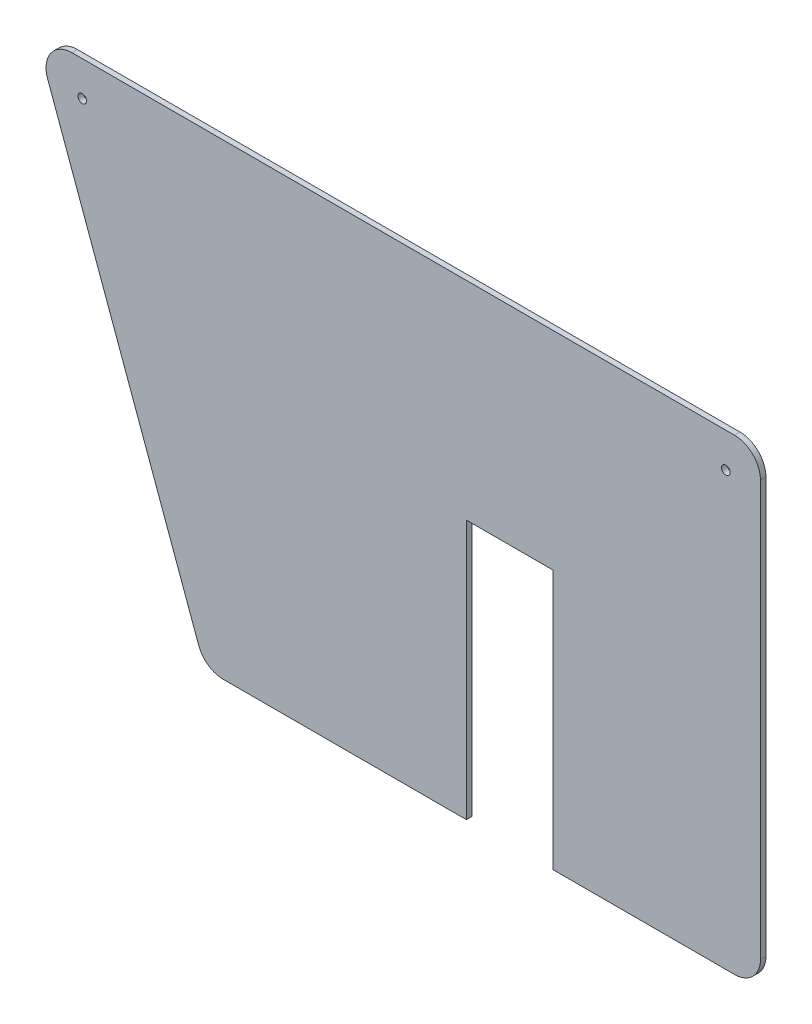
ISO-10303-21;
HEADER;
FILE_DESCRIPTION(('STEP AP214'),'2;1');
FILE_NAME('part.step','',(''),(''),'','','');
FILE_SCHEMA(('AUTOMOTIVE_DESIGN { 1 0 10303 214 1 1 1 1 }'));
ENDSEC;
DATA;
#1=APPLICATION_CONTEXT('core data for automotive mechanical design processes');
#2=APPLICATION_PROTOCOL_DEFINITION('international standard','automotive_design',2000,#1);
#3=PRODUCT_CONTEXT('',#1,'mechanical');
#4=PRODUCT('Part','Part','',(#3));
#5=PRODUCT_RELATED_PRODUCT_CATEGORY('part','',(#4));
#6=PRODUCT_DEFINITION_FORMATION('','',#4);
#7=PRODUCT_DEFINITION_CONTEXT('part definition',#1,'design');
#8=PRODUCT_DEFINITION('design','',#6,#7);
#9=PRODUCT_DEFINITION_SHAPE('','',#8);
#10=(LENGTH_UNIT() NAMED_UNIT(*) SI_UNIT(.MILLI.,.METRE.));
#11=(NAMED_UNIT(*) PLANE_ANGLE_UNIT() SI_UNIT($,.RADIAN.));
#12=(NAMED_UNIT(*) SI_UNIT($,.STERADIAN.) SOLID_ANGLE_UNIT());
#13=UNCERTAINTY_MEASURE_WITH_UNIT(LENGTH_MEASURE(1.E-05),#10,'distance_accuracy_value','');
#14=(GEOMETRIC_REPRESENTATION_CONTEXT(3) GLOBAL_UNCERTAINTY_ASSIGNED_CONTEXT((#13)) GLOBAL_UNIT_ASSIGNED_CONTEXT((#10,
#11,#12)) REPRESENTATION_CONTEXT('',''));
#15=CARTESIAN_POINT('',(0.,0.,0.));
#16=DIRECTION('',(0.,0.,1.));
#17=DIRECTION('',(1.,0.,0.));
#18=AXIS2_PLACEMENT_3D('',#15,#16,#17);
#19=CARTESIAN_POINT('',(-321.154386438124,0.,-3.175));
#20=DIRECTION('',(0.,-1.,0.));
#21=DIRECTION('',(1.,0.,0.));
#22=AXIS2_PLACEMENT_3D('',#19,#20,#21);
#23=PLANE('',#22);
#24=DIRECTION('',(0.,0.,-1.));
#25=VECTOR('',#24,1.);
#26=CARTESIAN_POINT('',(-120.,0.,6.825));
#27=LINE('',#26,#25);
#28=CARTESIAN_POINT('',(-120.,0.,0.));
#29=VERTEX_POINT('',#28);
#30=CARTESIAN_POINT('',(-120.,0.,-3.175));
#31=VERTEX_POINT('',#30);
#32=EDGE_CURVE('E165',#29,#31,#27,.T.);
#33=ORIENTED_EDGE('',*,*,#32,.T.);
#34=DIRECTION('',(1.,0.,0.));
#35=VECTOR('',#34,1.);
#36=CARTESIAN_POINT('',(-321.154386438124,0.,-3.175));
#37=LINE('',#36,#35);
#38=CARTESIAN_POINT('',(-15.,0.,-3.175));
#39=VERTEX_POINT('',#38);
#40=EDGE_CURVE('E153',#31,#39,#37,.T.);
#41=ORIENTED_EDGE('',*,*,#40,.T.);
#42=DIRECTION('',(0.,0.,1.));
#43=VECTOR('',#42,1.);
#44=CARTESIAN_POINT('',(-15.,0.,-3.175));
#45=LINE('',#44,#43);
#46=CARTESIAN_POINT('',(-15.,0.,0.));
#47=VERTEX_POINT('',#46);
#48=EDGE_CURVE('E176',#39,#47,#45,.T.);
#49=ORIENTED_EDGE('',*,*,#48,.T.);
#50=DIRECTION('',(1.,0.,0.));
#51=VECTOR('',#50,1.);
#52=CARTESIAN_POINT('',(-321.154386438124,0.,0.));
#53=LINE('',#52,#51);
#54=EDGE_CURVE('E168',#29,#47,#53,.T.);
#55=ORIENTED_EDGE('',*,*,#54,.F.);
#56=EDGE_LOOP('',(#33,#41,#49,#55));
#57=FACE_BOUND('',#56,.T.);
#58=ADVANCED_FACE('F39',(#57),#23,.T.);
#59=CARTESIAN_POINT('',(0.,270.,-3.175));
#60=DIRECTION('',(0.,1.,0.));
#61=DIRECTION('',(-1.,0.,0.));
#62=AXIS2_PLACEMENT_3D('',#59,#60,#61);
#63=PLANE('',#62);
#64=DIRECTION('',(-1.,0.,0.));
#65=VECTOR('',#64,1.);
#66=CARTESIAN_POINT('',(0.,270.,0.));
#67=LINE('',#66,#65);
#68=CARTESIAN_POINT('',(-15.,270.,0.));
#69=VERTEX_POINT('',#68);
#70=CARTESIAN_POINT('',(-398.004129588868,270.,0.));
#71=VERTEX_POINT('',#70);
#72=EDGE_CURVE('E161',#69,#71,#67,.T.);
#73=ORIENTED_EDGE('',*,*,#72,.F.);
#74=DIRECTION('',(0.,0.,1.));
#75=VECTOR('',#74,1.);
#76=CARTESIAN_POINT('',(-15.,270.,-3.175));
#77=LINE('',#76,#75);
#78=CARTESIAN_POINT('',(-15.,270.,-3.175));
#79=VERTEX_POINT('',#78);
#80=EDGE_CURVE('E203',#69,#79,#77,.F.);
#81=ORIENTED_EDGE('',*,*,#80,.T.);
#82=DIRECTION('',(-1.,0.,0.));
#83=VECTOR('',#82,1.);
#84=CARTESIAN_POINT('',(0.,270.,-3.175));
#85=LINE('',#84,#83);
#86=CARTESIAN_POINT('',(-398.004129588868,270.,-3.175));
#87=VERTEX_POINT('',#86);
#88=EDGE_CURVE('E174',#79,#87,#85,.T.);
#89=ORIENTED_EDGE('',*,*,#88,.T.);
#90=DIRECTION('',(0.,0.,1.));
#91=VECTOR('',#90,1.);
#92=CARTESIAN_POINT('',(-398.004129588868,270.,-3.175));
#93=LINE('',#92,#91);
#94=EDGE_CURVE('E200',#87,#71,#93,.T.);
#95=ORIENTED_EDGE('',*,*,#94,.T.);
#96=EDGE_LOOP('',(#73,#81,#89,#95));
#97=FACE_BOUND('',#96,.T.);
#98=ADVANCED_FACE('F281',(#97),#63,.T.);
#99=CARTESIAN_POINT('',(0.,270.,-3.175));
#100=DIRECTION('',(1.,0.,0.));
#101=DIRECTION('',(0.,1.,0.));
#102=AXIS2_PLACEMENT_3D('',#99,#100,#101);
#103=PLANE('',#102);
#104=DIRECTION('',(0.,1.,0.));
#105=VECTOR('',#104,1.);
#106=CARTESIAN_POINT('',(0.,270.,0.));
#107=LINE('',#106,#105);
#108=CARTESIAN_POINT('',(0.,15.,0.));
#109=VERTEX_POINT('',#108);
#110=CARTESIAN_POINT('',(0.,255.,0.));
#111=VERTEX_POINT('',#110);
#112=EDGE_CURVE('E171',#109,#111,#107,.T.);
#113=ORIENTED_EDGE('',*,*,#112,.F.);
#114=DIRECTION('',(0.,0.,1.));
#115=VECTOR('',#114,1.);
#116=CARTESIAN_POINT('',(0.,15.,-3.175));
#117=LINE('',#116,#115);
#118=CARTESIAN_POINT('',(0.,15.,-3.175));
#119=VERTEX_POINT('',#118);
#120=EDGE_CURVE('E190',#109,#119,#117,.F.);
#121=ORIENTED_EDGE('',*,*,#120,.T.);
#122=DIRECTION('',(0.,1.,0.));
#123=VECTOR('',#122,1.);
#124=CARTESIAN_POINT('',(0.,270.,-3.175));
#125=LINE('',#124,#123);
#126=CARTESIAN_POINT('',(0.,255.,-3.175));
#127=VERTEX_POINT('',#126);
#128=EDGE_CURVE('E152',#119,#127,#125,.T.);
#129=ORIENTED_EDGE('',*,*,#128,.T.);
#130=DIRECTION('',(0.,0.,1.));
#131=VECTOR('',#130,1.);
#132=CARTESIAN_POINT('',(0.,255.,-3.175));
#133=LINE('',#132,#131);
#134=EDGE_CURVE('E187',#127,#111,#133,.T.);
#135=ORIENTED_EDGE('',*,*,#134,.T.);
#136=EDGE_LOOP('',(#113,#121,#129,#135));
#137=FACE_BOUND('',#136,.T.);
#138=ADVANCED_FACE('F255',(#137),#103,.T.);
#139=DIRECTION('',(0.,0.,-1.));
#140=VECTOR('',#139,1.);
#141=CARTESIAN_POINT('',(-170.,0.,6.825));
#142=LINE('',#141,#140);
#143=CARTESIAN_POINT('',(-170.,0.,0.));
#144=VERTEX_POINT('',#143);
#145=CARTESIAN_POINT('',(-170.,0.,-3.175));
#146=VERTEX_POINT('',#145);
#147=EDGE_CURVE('E129',#144,#146,#142,.T.);
#148=ORIENTED_EDGE('',*,*,#147,.F.);
#149=CARTESIAN_POINT('',(-310.651273364978,0.,0.));
#150=VERTEX_POINT('',#149);
#151=EDGE_CURVE('E169',#150,#144,#53,.T.);
#152=ORIENTED_EDGE('',*,*,#151,.F.);
#153=DIRECTION('',(0.,0.,1.));
#154=VECTOR('',#153,1.);
#155=CARTESIAN_POINT('',(-310.651273364978,0.,-3.175));
#156=LINE('',#155,#154);
#157=CARTESIAN_POINT('',(-310.651273364978,0.,-3.175));
#158=VERTEX_POINT('',#157);
#159=EDGE_CURVE('E151',#150,#158,#156,.F.);
#160=ORIENTED_EDGE('',*,*,#159,.T.);
#161=EDGE_CURVE('E144',#158,#146,#37,.T.);
#162=ORIENTED_EDGE('',*,*,#161,.T.);
#163=EDGE_LOOP('',(#148,#152,#160,#162));
#164=FACE_BOUND('',#163,.T.);
#165=ADVANCED_FACE('F149',(#164),#23,.T.);
#166=CARTESIAN_POINT('',(-419.42634969,270.,-3.175));
#167=DIRECTION('',(-0.939692620785906,-0.342020143325674,0.));
#168=DIRECTION('',(0.342020143325674,-0.939692620785907,0.));
#169=AXIS2_PLACEMENT_3D('',#166,#167,#168);
#170=PLANE('',#169);
#171=DIRECTION('',(0.342020143325674,-0.939692620785907,0.));
#172=VECTOR('',#171,1.);
#173=CARTESIAN_POINT('',(-419.42634969,270.,-3.175));
#174=LINE('',#173,#172);
#175=CARTESIAN_POINT('',(-412.099518900657,249.869697850115,-3.175));
#176=VERTEX_POINT('',#175);
#177=CARTESIAN_POINT('',(-324.746662676767,9.86969785011488,-3.175));
#178=VERTEX_POINT('',#177);
#179=EDGE_CURVE('E157',#176,#178,#174,.T.);
#180=ORIENTED_EDGE('',*,*,#179,.T.);
#181=DIRECTION('',(0.,0.,1.));
#182=VECTOR('',#181,1.);
#183=CARTESIAN_POINT('',(-324.746662676767,9.86969785011493,-3.175));
#184=LINE('',#183,#182);
#185=CARTESIAN_POINT('',(-324.746662676767,9.86969785011488,0.));
#186=VERTEX_POINT('',#185);
#187=EDGE_CURVE('E207',#178,#186,#184,.T.);
#188=ORIENTED_EDGE('',*,*,#187,.T.);
#189=DIRECTION('',(0.342020143325674,-0.939692620785907,0.));
#190=VECTOR('',#189,1.);
#191=CARTESIAN_POINT('',(-419.42634969,270.,0.));
#192=LINE('',#191,#190);
#193=CARTESIAN_POINT('',(-412.099518900657,249.869697850115,0.));
#194=VERTEX_POINT('',#193);
#195=EDGE_CURVE('E164',#194,#186,#192,.T.);
#196=ORIENTED_EDGE('',*,*,#195,.F.);
#197=DIRECTION('',(0.,0.,1.));
#198=VECTOR('',#197,1.);
#199=CARTESIAN_POINT('',(-412.099518900657,249.869697850115,-3.175));
#200=LINE('',#199,#198);
#201=EDGE_CURVE('E205',#194,#176,#200,.F.);
#202=ORIENTED_EDGE('',*,*,#201,.T.);
#203=EDGE_LOOP('',(#180,#188,#196,#202));
#204=FACE_BOUND('',#203,.T.);
#205=ADVANCED_FACE('F237',(#204),#170,.T.);
#206=CARTESIAN_POINT('',(0.,0.,-3.175));
#207=DIRECTION('',(0.,0.,1.));
#208=DIRECTION('',(1.,0.,0.));
#209=AXIS2_PLACEMENT_3D('',#206,#207,#208);
#210=PLANE('',#209);
#211=CARTESIAN_POINT('',(-20.,250.,-3.175));
#212=DIRECTION('',(0.,0.,-1.));
#213=DIRECTION('',(-1.,0.,0.));
#214=AXIS2_PLACEMENT_3D('',#211,#212,#213);
#215=CIRCLE('',#214,2.5);
#216=CARTESIAN_POINT('',(-22.5,250.,-3.175));
#217=VERTEX_POINT('',#216);
#218=EDGE_CURVE('E213',#217,#217,#215,.T.);
#219=ORIENTED_EDGE('',*,*,#218,.F.);
#220=EDGE_LOOP('',(#219));
#221=FACE_BOUND('',#220,.T.);
#222=CARTESIAN_POINT('',(-392.099518900657,250.,-3.175));
#223=DIRECTION('',(0.,0.,-1.));
#224=DIRECTION('',(-1.,0.,0.));
#225=AXIS2_PLACEMENT_3D('',#222,#223,#224);
#226=CIRCLE('',#225,2.50000000000002);
#227=CARTESIAN_POINT('',(-394.599518900657,250.,-3.175));
#228=VERTEX_POINT('',#227);
#229=EDGE_CURVE('E218',#228,#228,#226,.T.);
#230=ORIENTED_EDGE('',*,*,#229,.F.);
#231=EDGE_LOOP('',(#230));
#232=FACE_BOUND('',#231,.T.);
#233=ORIENTED_EDGE('',*,*,#40,.F.);
#234=DIRECTION('',(0.,-1.,0.));
#235=VECTOR('',#234,1.);
#236=CARTESIAN_POINT('',(-120.,0.,-3.175));
#237=LINE('',#236,#235);
#238=CARTESIAN_POINT('',(-120.,150.,-3.175));
#239=VERTEX_POINT('',#238);
#240=EDGE_CURVE('E140',#239,#31,#237,.T.);
#241=ORIENTED_EDGE('',*,*,#240,.F.);
#242=DIRECTION('',(1.,0.,0.));
#243=VECTOR('',#242,1.);
#244=CARTESIAN_POINT('',(-120.,150.,-3.175));
#245=LINE('',#244,#243);
#246=CARTESIAN_POINT('',(-170.,150.,-3.175));
#247=VERTEX_POINT('',#246);
#248=EDGE_CURVE('E147',#247,#239,#245,.T.);
#249=ORIENTED_EDGE('',*,*,#248,.F.);
#250=DIRECTION('',(0.,1.,0.));
#251=VECTOR('',#250,1.);
#252=CARTESIAN_POINT('',(-170.,150.,-3.175));
#253=LINE('',#252,#251);
#254=EDGE_CURVE('E132',#146,#247,#253,.T.);
#255=ORIENTED_EDGE('',*,*,#254,.F.);
#256=ORIENTED_EDGE('',*,*,#161,.F.);
#257=CARTESIAN_POINT('',(-310.651273364978,15.,-3.175));
#258=DIRECTION('',(0.,0.,1.));
#259=DIRECTION('',(1.,0.,0.));
#260=AXIS2_PLACEMENT_3D('',#257,#258,#259);
#261=CIRCLE('',#260,15.);
#262=EDGE_CURVE('E64',#158,#178,#261,.F.);
#263=ORIENTED_EDGE('',*,*,#262,.T.);
#264=ORIENTED_EDGE('',*,*,#179,.F.);
#265=CARTESIAN_POINT('',(-398.004129588868,255.,-3.175));
#266=DIRECTION('',(0.,0.,1.));
#267=DIRECTION('',(1.,0.,0.));
#268=AXIS2_PLACEMENT_3D('',#265,#266,#267);
#269=CIRCLE('',#268,15.);
#270=EDGE_CURVE('E192',#176,#87,#269,.F.);
#271=ORIENTED_EDGE('',*,*,#270,.T.);
#272=ORIENTED_EDGE('',*,*,#88,.F.);
#273=CARTESIAN_POINT('',(-15.,255.,-3.175));
#274=DIRECTION('',(0.,0.,1.));
#275=DIRECTION('',(1.,0.,0.));
#276=AXIS2_PLACEMENT_3D('',#273,#274,#275);
#277=CIRCLE('',#276,15.);
#278=EDGE_CURVE('E195',#79,#127,#277,.F.);
#279=ORIENTED_EDGE('',*,*,#278,.T.);
#280=ORIENTED_EDGE('',*,*,#128,.F.);
#281=CARTESIAN_POINT('',(-15.,15.,-3.175));
#282=DIRECTION('',(0.,0.,1.));
#283=DIRECTION('',(1.,0.,0.));
#284=AXIS2_PLACEMENT_3D('',#281,#282,#283);
#285=CIRCLE('',#284,15.);
#286=EDGE_CURVE('E197',#119,#39,#285,.F.);
#287=ORIENTED_EDGE('',*,*,#286,.T.);
#288=EDGE_LOOP('',(#233,#241,#249,#255,#256,#263,#264,#271,#272,#279,#280,#287));
#289=FACE_BOUND('',#288,.T.);
#290=ADVANCED_FACE('F143',(#221,#232,#289),#210,.F.);
#291=CARTESIAN_POINT('',(0.,0.,0.));
#292=DIRECTION('',(0.,0.,1.));
#293=DIRECTION('',(1.,0.,0.));
#294=AXIS2_PLACEMENT_3D('',#291,#292,#293);
#295=PLANE('',#294);
#296=CARTESIAN_POINT('',(-20.,250.,0.));
#297=DIRECTION('',(0.,0.,1.));
#298=DIRECTION('',(1.,0.,0.));
#299=AXIS2_PLACEMENT_3D('',#296,#297,#298);
#300=CIRCLE('',#299,2.5);
#301=CARTESIAN_POINT('',(-17.5,250.,0.));
#302=VERTEX_POINT('',#301);
#303=EDGE_CURVE('E43',#302,#302,#300,.T.);
#304=ORIENTED_EDGE('',*,*,#303,.F.);
#305=EDGE_LOOP('',(#304));
#306=FACE_BOUND('',#305,.T.);
#307=CARTESIAN_POINT('',(-392.099518900657,250.,0.));
#308=DIRECTION('',(0.,0.,1.));
#309=DIRECTION('',(1.,0.,0.));
#310=AXIS2_PLACEMENT_3D('',#307,#308,#309);
#311=CIRCLE('',#310,2.50000000000002);
#312=CARTESIAN_POINT('',(-389.599518900657,250.,0.));
#313=VERTEX_POINT('',#312);
#314=EDGE_CURVE('E211',#313,#313,#311,.T.);
#315=ORIENTED_EDGE('',*,*,#314,.F.);
#316=EDGE_LOOP('',(#315));
#317=FACE_BOUND('',#316,.T.);
#318=DIRECTION('',(0.,1.,0.));
#319=VECTOR('',#318,1.);
#320=CARTESIAN_POINT('',(-120.,0.,0.));
#321=LINE('',#320,#319);
#322=CARTESIAN_POINT('',(-120.,150.,0.));
#323=VERTEX_POINT('',#322);
#324=EDGE_CURVE('E11',#29,#323,#321,.T.);
#325=ORIENTED_EDGE('',*,*,#324,.F.);
#326=ORIENTED_EDGE('',*,*,#54,.T.);
#327=CARTESIAN_POINT('',(-15.,15.,0.));
#328=DIRECTION('',(0.,0.,1.));
#329=DIRECTION('',(1.,0.,0.));
#330=AXIS2_PLACEMENT_3D('',#327,#328,#329);
#331=CIRCLE('',#330,15.);
#332=EDGE_CURVE('E185',#47,#109,#331,.T.);
#333=ORIENTED_EDGE('',*,*,#332,.T.);
#334=ORIENTED_EDGE('',*,*,#112,.T.);
#335=CARTESIAN_POINT('',(-15.,255.,0.));
#336=DIRECTION('',(0.,0.,1.));
#337=DIRECTION('',(1.,0.,0.));
#338=AXIS2_PLACEMENT_3D('',#335,#336,#337);
#339=CIRCLE('',#338,15.);
#340=EDGE_CURVE('E183',#111,#69,#339,.T.);
#341=ORIENTED_EDGE('',*,*,#340,.T.);
#342=ORIENTED_EDGE('',*,*,#72,.T.);
#343=CARTESIAN_POINT('',(-398.004129588868,255.,0.));
#344=DIRECTION('',(0.,0.,1.));
#345=DIRECTION('',(1.,0.,0.));
#346=AXIS2_PLACEMENT_3D('',#343,#344,#345);
#347=CIRCLE('',#346,15.);
#348=EDGE_CURVE('E179',#71,#194,#347,.T.);
#349=ORIENTED_EDGE('',*,*,#348,.T.);
#350=ORIENTED_EDGE('',*,*,#195,.T.);
#351=CARTESIAN_POINT('',(-310.651273364978,15.,0.));
#352=DIRECTION('',(0.,0.,1.));
#353=DIRECTION('',(1.,0.,0.));
#354=AXIS2_PLACEMENT_3D('',#351,#352,#353);
#355=CIRCLE('',#354,15.);
#356=EDGE_CURVE('E181',#186,#150,#355,.T.);
#357=ORIENTED_EDGE('',*,*,#356,.T.);
#358=ORIENTED_EDGE('',*,*,#151,.T.);
#359=DIRECTION('',(0.,-1.,0.));
#360=VECTOR('',#359,1.);
#361=CARTESIAN_POINT('',(-170.,0.,0.));
#362=LINE('',#361,#360);
#363=CARTESIAN_POINT('',(-170.,150.,0.));
#364=VERTEX_POINT('',#363);
#365=EDGE_CURVE('E135',#364,#144,#362,.T.);
#366=ORIENTED_EDGE('',*,*,#365,.F.);
#367=DIRECTION('',(-1.,0.,0.));
#368=VECTOR('',#367,1.);
#369=CARTESIAN_POINT('',(0.,150.,0.));
#370=LINE('',#369,#368);
#371=EDGE_CURVE('E48',#323,#364,#370,.T.);
#372=ORIENTED_EDGE('',*,*,#371,.F.);
#373=EDGE_LOOP('',(#325,#326,#333,#334,#341,#342,#349,#350,#357,#358,#366,#372));
#374=FACE_BOUND('',#373,.T.);
#375=ADVANCED_FACE('F245',(#306,#317,#374),#295,.T.);
#376=CARTESIAN_POINT('',(-15.,15.,-3.175));
#377=DIRECTION('',(0.,0.,1.));
#378=DIRECTION('',(1.,0.,0.));
#379=AXIS2_PLACEMENT_3D('',#376,#377,#378);
#380=CYLINDRICAL_SURFACE('',#379,15.);
#381=ORIENTED_EDGE('',*,*,#286,.F.);
#382=ORIENTED_EDGE('',*,*,#120,.F.);
#383=ORIENTED_EDGE('',*,*,#332,.F.);
#384=ORIENTED_EDGE('',*,*,#48,.F.);
#385=EDGE_LOOP('',(#381,#382,#383,#384));
#386=FACE_BOUND('',#385,.T.);
#387=ADVANCED_FACE('F263',(#386),#380,.T.);
#388=CARTESIAN_POINT('',(-15.,255.,-3.175));
#389=DIRECTION('',(0.,0.,1.));
#390=DIRECTION('',(1.,0.,0.));
#391=AXIS2_PLACEMENT_3D('',#388,#389,#390);
#392=CYLINDRICAL_SURFACE('',#391,15.);
#393=ORIENTED_EDGE('',*,*,#278,.F.);
#394=ORIENTED_EDGE('',*,*,#80,.F.);
#395=ORIENTED_EDGE('',*,*,#340,.F.);
#396=ORIENTED_EDGE('',*,*,#134,.F.);
#397=EDGE_LOOP('',(#393,#394,#395,#396));
#398=FACE_BOUND('',#397,.T.);
#399=ADVANCED_FACE('F252',(#398),#392,.T.);
#400=CARTESIAN_POINT('',(-310.651273364978,15.,-3.175));
#401=DIRECTION('',(0.,0.,1.));
#402=DIRECTION('',(1.,0.,0.));
#403=AXIS2_PLACEMENT_3D('',#400,#401,#402);
#404=CYLINDRICAL_SURFACE('',#403,15.);
#405=ORIENTED_EDGE('',*,*,#262,.F.);
#406=ORIENTED_EDGE('',*,*,#159,.F.);
#407=ORIENTED_EDGE('',*,*,#356,.F.);
#408=ORIENTED_EDGE('',*,*,#187,.F.);
#409=EDGE_LOOP('',(#405,#406,#407,#408));
#410=FACE_BOUND('',#409,.T.);
#411=ADVANCED_FACE('F242',(#410),#404,.T.);
#412=CARTESIAN_POINT('',(-398.004129588868,255.,-3.175));
#413=DIRECTION('',(0.,0.,1.));
#414=DIRECTION('',(1.,0.,0.));
#415=AXIS2_PLACEMENT_3D('',#412,#413,#414);
#416=CYLINDRICAL_SURFACE('',#415,15.);
#417=ORIENTED_EDGE('',*,*,#270,.F.);
#418=ORIENTED_EDGE('',*,*,#201,.F.);
#419=ORIENTED_EDGE('',*,*,#348,.F.);
#420=ORIENTED_EDGE('',*,*,#94,.F.);
#421=EDGE_LOOP('',(#417,#418,#419,#420));
#422=FACE_BOUND('',#421,.T.);
#423=ADVANCED_FACE('F41',(#422),#416,.T.);
#424=CARTESIAN_POINT('',(-120.,0.,6.825));
#425=DIRECTION('',(1.,0.,0.));
#426=DIRECTION('',(0.,0.,-1.));
#427=AXIS2_PLACEMENT_3D('',#424,#425,#426);
#428=PLANE('',#427);
#429=ORIENTED_EDGE('',*,*,#324,.T.);
#430=DIRECTION('',(0.,0.,-1.));
#431=VECTOR('',#430,1.);
#432=CARTESIAN_POINT('',(-120.,150.,6.825));
#433=LINE('',#432,#431);
#434=EDGE_CURVE('E229',#323,#239,#433,.T.);
#435=ORIENTED_EDGE('',*,*,#434,.T.);
#436=ORIENTED_EDGE('',*,*,#240,.T.);
#437=ORIENTED_EDGE('',*,*,#32,.F.);
#438=EDGE_LOOP('',(#429,#435,#436,#437));
#439=FACE_BOUND('',#438,.T.);
#440=ADVANCED_FACE('F266',(#439),#428,.F.);
#441=CARTESIAN_POINT('',(-120.,150.,6.825));
#442=DIRECTION('',(0.,1.,0.));
#443=DIRECTION('',(0.,0.,1.));
#444=AXIS2_PLACEMENT_3D('',#441,#442,#443);
#445=PLANE('',#444);
#446=ORIENTED_EDGE('',*,*,#371,.T.);
#447=DIRECTION('',(0.,0.,-1.));
#448=VECTOR('',#447,1.);
#449=CARTESIAN_POINT('',(-170.,150.,6.825));
#450=LINE('',#449,#448);
#451=EDGE_CURVE('E56',#364,#247,#450,.T.);
#452=ORIENTED_EDGE('',*,*,#451,.T.);
#453=ORIENTED_EDGE('',*,*,#248,.T.);
#454=ORIENTED_EDGE('',*,*,#434,.F.);
#455=EDGE_LOOP('',(#446,#452,#453,#454));
#456=FACE_BOUND('',#455,.T.);
#457=ADVANCED_FACE('F270',(#456),#445,.F.);
#458=CARTESIAN_POINT('',(-170.,150.,6.825));
#459=DIRECTION('',(-1.,0.,0.));
#460=DIRECTION('',(0.,-1.,0.));
#461=AXIS2_PLACEMENT_3D('',#458,#459,#460);
#462=PLANE('',#461);
#463=ORIENTED_EDGE('',*,*,#365,.T.);
#464=ORIENTED_EDGE('',*,*,#147,.T.);
#465=ORIENTED_EDGE('',*,*,#254,.T.);
#466=ORIENTED_EDGE('',*,*,#451,.F.);
#467=EDGE_LOOP('',(#463,#464,#465,#466));
#468=FACE_BOUND('',#467,.T.);
#469=ADVANCED_FACE('F131',(#468),#462,.F.);
#470=CARTESIAN_POINT('',(-392.099518900657,250.,6.825));
#471=DIRECTION('',(0.,0.,-1.));
#472=DIRECTION('',(-1.,0.,0.));
#473=AXIS2_PLACEMENT_3D('',#470,#471,#472);
#474=CYLINDRICAL_SURFACE('',#473,2.50000000000002);
#475=ORIENTED_EDGE('',*,*,#314,.T.);
#476=EDGE_LOOP('',(#475));
#477=FACE_BOUND('',#476,.T.);
#478=ORIENTED_EDGE('',*,*,#229,.T.);
#479=EDGE_LOOP('',(#478));
#480=FACE_BOUND('',#479,.T.);
#481=ADVANCED_FACE('F277',(#477,#480),#474,.F.);
#482=CARTESIAN_POINT('',(-20.,250.,6.825));
#483=DIRECTION('',(0.,0.,-1.));
#484=DIRECTION('',(-1.,0.,0.));
#485=AXIS2_PLACEMENT_3D('',#482,#483,#484);
#486=CYLINDRICAL_SURFACE('',#485,2.5);
#487=ORIENTED_EDGE('',*,*,#303,.T.);
#488=EDGE_LOOP('',(#487));
#489=FACE_BOUND('',#488,.T.);
#490=ORIENTED_EDGE('',*,*,#218,.T.);
#491=EDGE_LOOP('',(#490));
#492=FACE_BOUND('',#491,.T.);
#493=ADVANCED_FACE('F308',(#489,#492),#486,.F.);
#494=CLOSED_SHELL('',(#58,#98,#138,#165,#205,#290,#375,#387,#399,#411,#423,#440,#457,#469,#481,#493));
#495=MANIFOLD_SOLID_BREP('B2',#494);
#496=ADVANCED_BREP_SHAPE_REPRESENTATION('',(#18,#495),#14);
#497=SHAPE_DEFINITION_REPRESENTATION(#9,#496);
ENDSEC;
END-ISO-10303-21;
